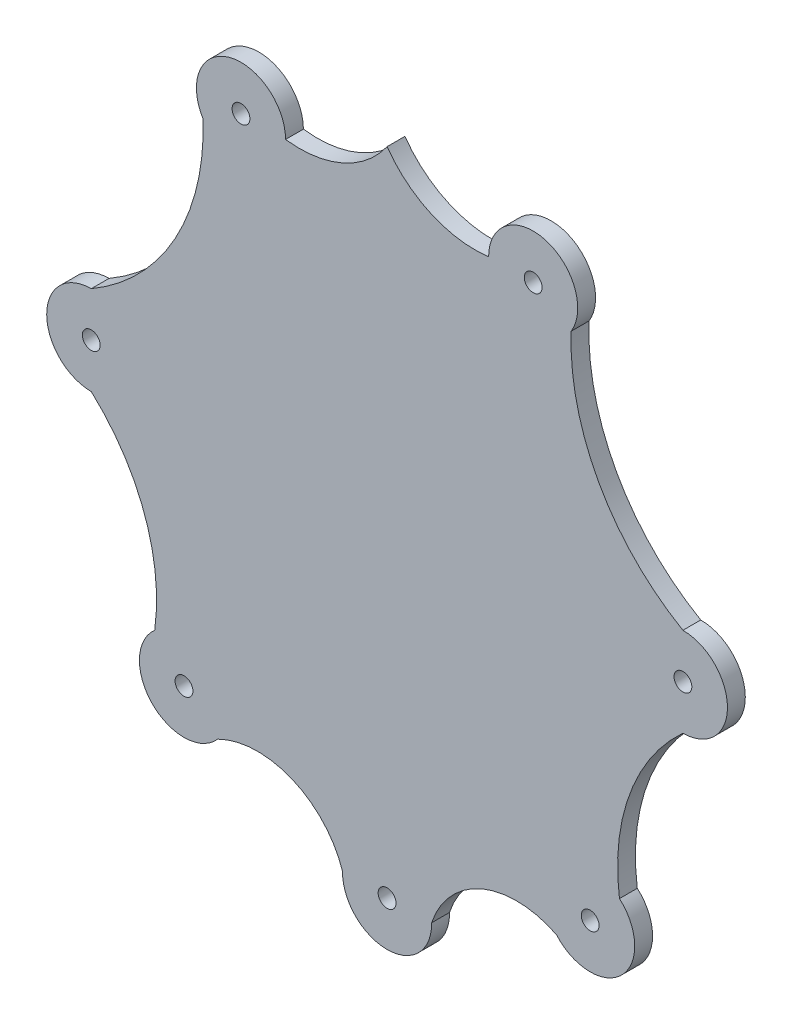
ISO-10303-21;
HEADER;
FILE_DESCRIPTION(('STEP AP214'),'2;1');
FILE_NAME('part.step','',(''),(''),'','','');
FILE_SCHEMA(('AUTOMOTIVE_DESIGN { 1 0 10303 214 1 1 1 1 }'));
ENDSEC;
DATA;
#1=APPLICATION_CONTEXT('core data for automotive mechanical design processes');
#2=APPLICATION_PROTOCOL_DEFINITION('international standard','automotive_design',2000,#1);
#3=PRODUCT_CONTEXT('',#1,'mechanical');
#4=PRODUCT('Part','Part','',(#3));
#5=PRODUCT_RELATED_PRODUCT_CATEGORY('part','',(#4));
#6=PRODUCT_DEFINITION_FORMATION('','',#4);
#7=PRODUCT_DEFINITION_CONTEXT('part definition',#1,'design');
#8=PRODUCT_DEFINITION('design','',#6,#7);
#9=PRODUCT_DEFINITION_SHAPE('','',#8);
#10=(LENGTH_UNIT() NAMED_UNIT(*) SI_UNIT(.MILLI.,.METRE.));
#11=(NAMED_UNIT(*) PLANE_ANGLE_UNIT() SI_UNIT($,.RADIAN.));
#12=(NAMED_UNIT(*) SI_UNIT($,.STERADIAN.) SOLID_ANGLE_UNIT());
#13=UNCERTAINTY_MEASURE_WITH_UNIT(LENGTH_MEASURE(1.E-05),#10,'distance_accuracy_value','');
#14=(GEOMETRIC_REPRESENTATION_CONTEXT(3) GLOBAL_UNCERTAINTY_ASSIGNED_CONTEXT((#13)) GLOBAL_UNIT_ASSIGNED_CONTEXT((#10,
#11,#12)) REPRESENTATION_CONTEXT('',''));
#15=CARTESIAN_POINT('',(0.,0.,0.));
#16=DIRECTION('',(0.,0.,1.));
#17=DIRECTION('',(1.,0.,0.));
#18=AXIS2_PLACEMENT_3D('',#15,#16,#17);
#19=CARTESIAN_POINT('',(-46.0489013592421,105.344998508358,5.));
#20=DIRECTION('',(0.,0.,1.));
#21=DIRECTION('',(1.,0.,0.));
#22=AXIS2_PLACEMENT_3D('',#19,#20,#21);
#23=PLANE('',#22);
#24=CARTESIAN_POINT('',(-102.986841911195,38.9932047085217,5.));
#25=DIRECTION('',(0.,0.,-1.));
#26=DIRECTION('',(-1.,0.,0.));
#27=AXIS2_PLACEMENT_3D('',#24,#25,#26);
#28=CIRCLE('',#27,2.5);
#29=CARTESIAN_POINT('',(-105.486841911195,38.9932047085217,5.));
#30=VERTEX_POINT('',#29);
#31=EDGE_CURVE('E248',#30,#30,#28,.T.);
#32=ORIENTED_EDGE('',*,*,#31,.T.);
#33=EDGE_LOOP('',(#32));
#34=FACE_BOUND('',#33,.T.);
#35=CARTESIAN_POINT('',(-129.,110.,5.));
#36=DIRECTION('',(0.,0.,-1.));
#37=DIRECTION('',(-1.,0.,0.));
#38=AXIS2_PLACEMENT_3D('',#35,#36,#37);
#39=CIRCLE('',#38,2.5);
#40=CARTESIAN_POINT('',(-131.5,110.,5.));
#41=VERTEX_POINT('',#40);
#42=EDGE_CURVE('E251',#41,#41,#39,.T.);
#43=ORIENTED_EDGE('',*,*,#42,.T.);
#44=EDGE_LOOP('',(#43));
#45=FACE_BOUND('',#44,.T.);
#46=CARTESIAN_POINT('',(-87.,186.,5.));
#47=DIRECTION('',(0.,0.,-1.));
#48=DIRECTION('',(-1.,0.,0.));
#49=AXIS2_PLACEMENT_3D('',#46,#47,#48);
#50=CIRCLE('',#49,2.5);
#51=CARTESIAN_POINT('',(-89.5,186.,5.));
#52=VERTEX_POINT('',#51);
#53=EDGE_CURVE('E254',#52,#52,#50,.T.);
#54=ORIENTED_EDGE('',*,*,#53,.T.);
#55=EDGE_LOOP('',(#54));
#56=FACE_BOUND('',#55,.T.);
#57=CARTESIAN_POINT('',(-46.0179505234573,15.949312442422,5.));
#58=DIRECTION('',(0.,0.,-1.));
#59=DIRECTION('',(-1.,0.,0.));
#60=AXIS2_PLACEMENT_3D('',#57,#58,#59);
#61=CIRCLE('',#60,2.5);
#62=CARTESIAN_POINT('',(-48.5179505234573,15.949312442422,5.));
#63=VERTEX_POINT('',#62);
#64=EDGE_CURVE('E257',#63,#63,#61,.T.);
#65=ORIENTED_EDGE('',*,*,#64,.T.);
#66=EDGE_LOOP('',(#65));
#67=FACE_BOUND('',#66,.T.);
#68=CARTESIAN_POINT('',(10.9509408642802,38.9932047085217,5.));
#69=DIRECTION('',(0.,0.,-1.));
#70=DIRECTION('',(-1.,0.,0.));
#71=AXIS2_PLACEMENT_3D('',#68,#69,#70);
#72=CIRCLE('',#71,2.5);
#73=CARTESIAN_POINT('',(8.45094086428022,38.9932047085217,5.));
#74=VERTEX_POINT('',#73);
#75=EDGE_CURVE('E260',#74,#74,#72,.T.);
#76=ORIENTED_EDGE('',*,*,#75,.T.);
#77=EDGE_LOOP('',(#76));
#78=FACE_BOUND('',#77,.T.);
#79=CARTESIAN_POINT('',(-5.03590104691458,186.,5.));
#80=DIRECTION('',(0.,0.,-1.));
#81=DIRECTION('',(-1.,0.,0.));
#82=AXIS2_PLACEMENT_3D('',#79,#80,#81);
#83=CIRCLE('',#82,2.5);
#84=CARTESIAN_POINT('',(-7.53590104691458,186.,5.));
#85=VERTEX_POINT('',#84);
#86=EDGE_CURVE('E262',#85,#85,#83,.T.);
#87=ORIENTED_EDGE('',*,*,#86,.T.);
#88=EDGE_LOOP('',(#87));
#89=FACE_BOUND('',#88,.T.);
#90=CARTESIAN_POINT('',(36.9640989530854,110.,5.));
#91=DIRECTION('',(0.,0.,-1.));
#92=DIRECTION('',(-1.,0.,0.));
#93=AXIS2_PLACEMENT_3D('',#90,#91,#92);
#94=CIRCLE('',#93,2.5);
#95=CARTESIAN_POINT('',(34.4640989530854,110.,5.));
#96=VERTEX_POINT('',#95);
#97=EDGE_CURVE('E133',#96,#96,#94,.T.);
#98=ORIENTED_EDGE('',*,*,#97,.T.);
#99=EDGE_LOOP('',(#98));
#100=FACE_BOUND('',#99,.T.);
#101=CARTESIAN_POINT('',(-70.5892479757029,215.788187083648,5.));
#102=DIRECTION('',(0.,0.,1.));
#103=DIRECTION('',(1.,0.,0.));
#104=AXIS2_PLACEMENT_3D('',#101,#102,#103);
#105=CIRCLE('',#104,30.0438025410554);
#106=CARTESIAN_POINT('',(-46.0179505234573,198.5,5.));
#107=VERTEX_POINT('',#106);
#108=CARTESIAN_POINT('',(-74.5,186.,5.));
#109=VERTEX_POINT('',#108);
#110=EDGE_CURVE('E148',#107,#109,#105,.F.);
#111=ORIENTED_EDGE('',*,*,#110,.T.);
#112=CARTESIAN_POINT('',(-87.,186.,5.));
#113=DIRECTION('',(0.,0.,1.));
#114=DIRECTION('',(1.,0.,0.));
#115=AXIS2_PLACEMENT_3D('',#112,#113,#114);
#116=CIRCLE('',#115,12.5);
#117=CARTESIAN_POINT('',(-97.6699129534475,179.488244663238,5.));
#118=VERTEX_POINT('',#117);
#119=EDGE_CURVE('E145',#118,#109,#116,.F.);
#120=ORIENTED_EDGE('',*,*,#119,.F.);
#121=CARTESIAN_POINT('',(-160.416977120088,176.878123739293,5.));
#122=DIRECTION('',(0.,0.,1.));
#123=DIRECTION('',(1.,0.,0.));
#124=AXIS2_PLACEMENT_3D('',#121,#122,#123);
#125=CIRCLE('',#124,62.8013279538742);
#126=CARTESIAN_POINT('',(-129.,122.499999999999,5.));
#127=VERTEX_POINT('',#126);
#128=EDGE_CURVE('E137',#118,#127,#125,.F.);
#129=ORIENTED_EDGE('',*,*,#128,.T.);
#130=CARTESIAN_POINT('',(-129.,110.,5.));
#131=DIRECTION('',(0.,0.,1.));
#132=DIRECTION('',(1.,0.,0.));
#133=AXIS2_PLACEMENT_3D('',#130,#131,#132);
#134=CIRCLE('',#133,12.4999999999988);
#135=CARTESIAN_POINT('',(-129.,97.5000000000013,5.));
#136=VERTEX_POINT('',#135);
#137=EDGE_CURVE('E130',#136,#127,#134,.F.);
#138=ORIENTED_EDGE('',*,*,#137,.F.);
#139=CARTESIAN_POINT('',(-166.683339145852,56.0655336656249,5.));
#140=DIRECTION('',(0.,0.,1.));
#141=DIRECTION('',(1.,0.,0.));
#142=AXIS2_PLACEMENT_3D('',#139,#140,#141);
#143=CIRCLE('',#142,56.0075802869209);
#144=CARTESIAN_POINT('',(-111.200647436843,48.4156990060434,5.));
#145=VERTEX_POINT('',#144);
#146=EDGE_CURVE('E19',#136,#145,#143,.F.);
#147=ORIENTED_EDGE('',*,*,#146,.T.);
#148=CARTESIAN_POINT('',(-102.986841911195,38.9932047085217,5.));
#149=DIRECTION('',(0.,0.,1.));
#150=DIRECTION('',(1.,0.,0.));
#151=AXIS2_PLACEMENT_3D('',#148,#149,#150);
#152=CIRCLE('',#151,12.5);
#153=CARTESIAN_POINT('',(-93.553180016707,30.7922277386425,5.));
#154=VERTEX_POINT('',#153);
#155=EDGE_CURVE('E128',#154,#145,#152,.F.);
#156=ORIENTED_EDGE('',*,*,#155,.F.);
#157=CARTESIAN_POINT('',(-82.3260805145803,8.38866064549752,5.));
#158=DIRECTION('',(0.,0.,1.));
#159=DIRECTION('',(1.,0.,0.));
#160=AXIS2_PLACEMENT_3D('',#157,#158,#159);
#161=CIRCLE('',#160,25.0592813489873);
#162=CARTESIAN_POINT('',(-58.515431911795,16.2002286598195,5.));
#163=VERTEX_POINT('',#162);
#164=EDGE_CURVE('E178',#154,#163,#161,.F.);
#165=ORIENTED_EDGE('',*,*,#164,.T.);
#166=CARTESIAN_POINT('',(-46.0179505234573,15.949312442422,5.));
#167=DIRECTION('',(0.,0.,1.));
#168=DIRECTION('',(1.,0.,0.));
#169=AXIS2_PLACEMENT_3D('',#166,#167,#168);
#170=CIRCLE('',#169,12.5);
#171=CARTESIAN_POINT('',(-33.5204691351196,16.2002286598196,5.));
#172=VERTEX_POINT('',#171);
#173=EDGE_CURVE('E175',#172,#163,#170,.F.);
#174=ORIENTED_EDGE('',*,*,#173,.F.);
#175=CARTESIAN_POINT('',(-9.70982053233428,8.38866064549752,5.));
#176=DIRECTION('',(0.,0.,1.));
#177=DIRECTION('',(1.,0.,0.));
#178=AXIS2_PLACEMENT_3D('',#175,#176,#177);
#179=CIRCLE('',#178,25.0592813489873);
#180=CARTESIAN_POINT('',(1.51727896979237,30.7922277386425,5.));
#181=VERTEX_POINT('',#180);
#182=EDGE_CURVE('E171',#172,#181,#179,.F.);
#183=ORIENTED_EDGE('',*,*,#182,.T.);
#184=CARTESIAN_POINT('',(10.9509408642802,38.9932047085217,5.));
#185=DIRECTION('',(0.,0.,1.));
#186=DIRECTION('',(1.,0.,0.));
#187=AXIS2_PLACEMENT_3D('',#184,#185,#186);
#188=CIRCLE('',#187,12.5);
#189=CARTESIAN_POINT('',(19.1647463899285,48.4156990060434,5.));
#190=VERTEX_POINT('',#189);
#191=EDGE_CURVE('E168',#190,#181,#188,.F.);
#192=ORIENTED_EDGE('',*,*,#191,.F.);
#193=CARTESIAN_POINT('',(74.6474380989377,56.0655336656249,5.));
#194=DIRECTION('',(0.,0.,1.));
#195=DIRECTION('',(1.,0.,0.));
#196=AXIS2_PLACEMENT_3D('',#193,#194,#195);
#197=CIRCLE('',#196,56.0075802869209);
#198=CARTESIAN_POINT('',(36.9640989530854,97.5000000000013,5.));
#199=VERTEX_POINT('',#198);
#200=EDGE_CURVE('E164',#190,#199,#197,.F.);
#201=ORIENTED_EDGE('',*,*,#200,.T.);
#202=CARTESIAN_POINT('',(36.9640989530854,110.,5.));
#203=DIRECTION('',(0.,0.,1.));
#204=DIRECTION('',(1.,0.,0.));
#205=AXIS2_PLACEMENT_3D('',#202,#203,#204);
#206=CIRCLE('',#205,12.4999999999988);
#207=CARTESIAN_POINT('',(36.9640989530854,122.499999999999,5.));
#208=VERTEX_POINT('',#207);
#209=EDGE_CURVE('E161',#208,#199,#206,.F.);
#210=ORIENTED_EDGE('',*,*,#209,.F.);
#211=CARTESIAN_POINT('',(68.381076073173,176.878123739293,5.));
#212=DIRECTION('',(0.,0.,1.));
#213=DIRECTION('',(1.,0.,0.));
#214=AXIS2_PLACEMENT_3D('',#211,#212,#213);
#215=CIRCLE('',#214,62.8013279538742);
#216=CARTESIAN_POINT('',(5.63401190653296,179.488244663238,5.));
#217=VERTEX_POINT('',#216);
#218=EDGE_CURVE('E157',#208,#217,#215,.F.);
#219=ORIENTED_EDGE('',*,*,#218,.T.);
#220=CARTESIAN_POINT('',(-5.03590104691458,186.,5.));
#221=DIRECTION('',(0.,0.,1.));
#222=DIRECTION('',(1.,0.,0.));
#223=AXIS2_PLACEMENT_3D('',#220,#221,#222);
#224=CIRCLE('',#223,12.5);
#225=CARTESIAN_POINT('',(-17.5359010469146,186.,5.));
#226=VERTEX_POINT('',#225);
#227=EDGE_CURVE('E154',#226,#217,#224,.F.);
#228=ORIENTED_EDGE('',*,*,#227,.F.);
#229=CARTESIAN_POINT('',(-21.4466530712117,215.788187083648,5.));
#230=DIRECTION('',(0.,0.,1.));
#231=DIRECTION('',(1.,0.,0.));
#232=AXIS2_PLACEMENT_3D('',#229,#230,#231);
#233=CIRCLE('',#232,30.0438025410554);
#234=EDGE_CURVE('E151',#226,#107,#233,.F.);
#235=ORIENTED_EDGE('',*,*,#234,.T.);
#236=EDGE_LOOP('',(#111,#120,#129,#138,#147,#156,#165,#174,#183,#192,#201,#210,#219,#228,#235));
#237=FACE_BOUND('',#236,.T.);
#238=ADVANCED_FACE('F16',(#34,#45,#56,#67,#78,#89,#100,#237),#23,.T.);
#239=CARTESIAN_POINT('',(-166.683339145852,56.0655336656249,0.));
#240=DIRECTION('',(0.,0.,1.));
#241=DIRECTION('',(1.,0.,0.));
#242=AXIS2_PLACEMENT_3D('',#239,#240,#241);
#243=CYLINDRICAL_SURFACE('',#242,56.0075802869209);
#244=DIRECTION('',(0.,0.,1.));
#245=VECTOR('',#244,1.);
#246=CARTESIAN_POINT('',(-129.,97.5000000000013,0.));
#247=LINE('',#246,#245);
#248=CARTESIAN_POINT('',(-129.,97.5000000000013,0.));
#249=VERTEX_POINT('',#248);
#250=EDGE_CURVE('E124',#249,#136,#247,.T.);
#251=ORIENTED_EDGE('',*,*,#250,.F.);
#252=CARTESIAN_POINT('',(-166.683339145852,56.0655336656249,0.));
#253=DIRECTION('',(0.,0.,1.));
#254=DIRECTION('',(1.,0.,0.));
#255=AXIS2_PLACEMENT_3D('',#252,#253,#254);
#256=CIRCLE('',#255,56.0075802869209);
#257=CARTESIAN_POINT('',(-111.200647436843,48.4156990060434,0.));
#258=VERTEX_POINT('',#257);
#259=EDGE_CURVE('E246',#249,#258,#256,.F.);
#260=ORIENTED_EDGE('',*,*,#259,.T.);
#261=DIRECTION('',(0.,0.,1.));
#262=VECTOR('',#261,1.);
#263=CARTESIAN_POINT('',(-111.200647436843,48.4156990060434,0.));
#264=LINE('',#263,#262);
#265=EDGE_CURVE('E125',#145,#258,#264,.F.);
#266=ORIENTED_EDGE('',*,*,#265,.F.);
#267=ORIENTED_EDGE('',*,*,#146,.F.);
#268=EDGE_LOOP('',(#251,#260,#266,#267));
#269=FACE_BOUND('',#268,.T.);
#270=ADVANCED_FACE('F122',(#269),#243,.F.);
#271=CARTESIAN_POINT('',(-102.986841911195,38.9932047085217,0.));
#272=DIRECTION('',(0.,0.,1.));
#273=DIRECTION('',(1.,0.,0.));
#274=AXIS2_PLACEMENT_3D('',#271,#272,#273);
#275=CYLINDRICAL_SURFACE('',#274,12.5);
#276=CARTESIAN_POINT('',(-102.986841911195,38.9932047085217,0.));
#277=DIRECTION('',(0.,0.,1.));
#278=DIRECTION('',(1.,0.,0.));
#279=AXIS2_PLACEMENT_3D('',#276,#277,#278);
#280=CIRCLE('',#279,12.5);
#281=CARTESIAN_POINT('',(-93.553180016707,30.7922277386425,0.));
#282=VERTEX_POINT('',#281);
#283=EDGE_CURVE('E244',#258,#282,#280,.T.);
#284=ORIENTED_EDGE('',*,*,#283,.T.);
#285=DIRECTION('',(0.,0.,1.));
#286=VECTOR('',#285,1.);
#287=CARTESIAN_POINT('',(-93.553180016707,30.7922277386425,0.));
#288=LINE('',#287,#286);
#289=EDGE_CURVE('E180',#282,#154,#288,.T.);
#290=ORIENTED_EDGE('',*,*,#289,.T.);
#291=ORIENTED_EDGE('',*,*,#155,.T.);
#292=ORIENTED_EDGE('',*,*,#265,.T.);
#293=EDGE_LOOP('',(#284,#290,#291,#292));
#294=FACE_BOUND('',#293,.T.);
#295=ADVANCED_FACE('F318',(#294),#275,.T.);
#296=CARTESIAN_POINT('',(-82.3260805145803,8.38866064549752,0.));
#297=DIRECTION('',(0.,0.,1.));
#298=DIRECTION('',(1.,0.,0.));
#299=AXIS2_PLACEMENT_3D('',#296,#297,#298);
#300=CYLINDRICAL_SURFACE('',#299,25.0592813489873);
#301=ORIENTED_EDGE('',*,*,#289,.F.);
#302=CARTESIAN_POINT('',(-82.3260805145803,8.38866064549752,0.));
#303=DIRECTION('',(0.,0.,1.));
#304=DIRECTION('',(1.,0.,0.));
#305=AXIS2_PLACEMENT_3D('',#302,#303,#304);
#306=CIRCLE('',#305,25.0592813489873);
#307=CARTESIAN_POINT('',(-58.515431911795,16.2002286598195,0.));
#308=VERTEX_POINT('',#307);
#309=EDGE_CURVE('E241',#282,#308,#306,.F.);
#310=ORIENTED_EDGE('',*,*,#309,.T.);
#311=DIRECTION('',(0.,0.,1.));
#312=VECTOR('',#311,1.);
#313=CARTESIAN_POINT('',(-58.515431911795,16.2002286598196,0.));
#314=LINE('',#313,#312);
#315=EDGE_CURVE('E177',#163,#308,#314,.F.);
#316=ORIENTED_EDGE('',*,*,#315,.F.);
#317=ORIENTED_EDGE('',*,*,#164,.F.);
#318=EDGE_LOOP('',(#301,#310,#316,#317));
#319=FACE_BOUND('',#318,.T.);
#320=ADVANCED_FACE('F317',(#319),#300,.F.);
#321=CARTESIAN_POINT('',(-46.0179505234573,15.949312442422,0.));
#322=DIRECTION('',(0.,0.,1.));
#323=DIRECTION('',(1.,0.,0.));
#324=AXIS2_PLACEMENT_3D('',#321,#322,#323);
#325=CYLINDRICAL_SURFACE('',#324,12.5);
#326=CARTESIAN_POINT('',(-46.0179505234573,15.949312442422,0.));
#327=DIRECTION('',(0.,0.,1.));
#328=DIRECTION('',(1.,0.,0.));
#329=AXIS2_PLACEMENT_3D('',#326,#327,#328);
#330=CIRCLE('',#329,12.5);
#331=CARTESIAN_POINT('',(-33.5204691351196,16.2002286598196,0.));
#332=VERTEX_POINT('',#331);
#333=EDGE_CURVE('E238',#308,#332,#330,.T.);
#334=ORIENTED_EDGE('',*,*,#333,.T.);
#335=DIRECTION('',(0.,0.,1.));
#336=VECTOR('',#335,1.);
#337=CARTESIAN_POINT('',(-33.5204691351196,16.2002286598196,0.));
#338=LINE('',#337,#336);
#339=EDGE_CURVE('E174',#332,#172,#338,.T.);
#340=ORIENTED_EDGE('',*,*,#339,.T.);
#341=ORIENTED_EDGE('',*,*,#173,.T.);
#342=ORIENTED_EDGE('',*,*,#315,.T.);
#343=EDGE_LOOP('',(#334,#340,#341,#342));
#344=FACE_BOUND('',#343,.T.);
#345=ADVANCED_FACE('F311',(#344),#325,.T.);
#346=CARTESIAN_POINT('',(-9.70982053233428,8.38866064549752,0.));
#347=DIRECTION('',(0.,0.,1.));
#348=DIRECTION('',(1.,0.,0.));
#349=AXIS2_PLACEMENT_3D('',#346,#347,#348);
#350=CYLINDRICAL_SURFACE('',#349,25.0592813489873);
#351=ORIENTED_EDGE('',*,*,#339,.F.);
#352=CARTESIAN_POINT('',(-9.70982053233428,8.38866064549752,0.));
#353=DIRECTION('',(0.,0.,1.));
#354=DIRECTION('',(1.,0.,0.));
#355=AXIS2_PLACEMENT_3D('',#352,#353,#354);
#356=CIRCLE('',#355,25.0592813489873);
#357=CARTESIAN_POINT('',(1.51727896979237,30.7922277386425,0.));
#358=VERTEX_POINT('',#357);
#359=EDGE_CURVE('E235',#332,#358,#356,.F.);
#360=ORIENTED_EDGE('',*,*,#359,.T.);
#361=DIRECTION('',(0.,0.,1.));
#362=VECTOR('',#361,1.);
#363=CARTESIAN_POINT('',(1.51727896979237,30.7922277386425,0.));
#364=LINE('',#363,#362);
#365=EDGE_CURVE('E170',#181,#358,#364,.F.);
#366=ORIENTED_EDGE('',*,*,#365,.F.);
#367=ORIENTED_EDGE('',*,*,#182,.F.);
#368=EDGE_LOOP('',(#351,#360,#366,#367));
#369=FACE_BOUND('',#368,.T.);
#370=ADVANCED_FACE('F330',(#369),#350,.F.);
#371=CARTESIAN_POINT('',(10.9509408642802,38.9932047085217,0.));
#372=DIRECTION('',(0.,0.,1.));
#373=DIRECTION('',(1.,0.,0.));
#374=AXIS2_PLACEMENT_3D('',#371,#372,#373);
#375=CYLINDRICAL_SURFACE('',#374,12.5);
#376=CARTESIAN_POINT('',(10.9509408642802,38.9932047085217,0.));
#377=DIRECTION('',(0.,0.,1.));
#378=DIRECTION('',(1.,0.,0.));
#379=AXIS2_PLACEMENT_3D('',#376,#377,#378);
#380=CIRCLE('',#379,12.5);
#381=CARTESIAN_POINT('',(19.1647463899285,48.4156990060434,0.));
#382=VERTEX_POINT('',#381);
#383=EDGE_CURVE('E232',#358,#382,#380,.T.);
#384=ORIENTED_EDGE('',*,*,#383,.T.);
#385=DIRECTION('',(0.,0.,1.));
#386=VECTOR('',#385,1.);
#387=CARTESIAN_POINT('',(19.1647463899285,48.4156990060434,0.));
#388=LINE('',#387,#386);
#389=EDGE_CURVE('E167',#382,#190,#388,.T.);
#390=ORIENTED_EDGE('',*,*,#389,.T.);
#391=ORIENTED_EDGE('',*,*,#191,.T.);
#392=ORIENTED_EDGE('',*,*,#365,.T.);
#393=EDGE_LOOP('',(#384,#390,#391,#392));
#394=FACE_BOUND('',#393,.T.);
#395=ADVANCED_FACE('F333',(#394),#375,.T.);
#396=CARTESIAN_POINT('',(74.6474380989377,56.0655336656249,0.));
#397=DIRECTION('',(0.,0.,1.));
#398=DIRECTION('',(1.,0.,0.));
#399=AXIS2_PLACEMENT_3D('',#396,#397,#398);
#400=CYLINDRICAL_SURFACE('',#399,56.0075802869209);
#401=ORIENTED_EDGE('',*,*,#389,.F.);
#402=CARTESIAN_POINT('',(74.6474380989377,56.0655336656249,0.));
#403=DIRECTION('',(0.,0.,1.));
#404=DIRECTION('',(1.,0.,0.));
#405=AXIS2_PLACEMENT_3D('',#402,#403,#404);
#406=CIRCLE('',#405,56.0075802869209);
#407=CARTESIAN_POINT('',(36.9640989530854,97.5000000000013,0.));
#408=VERTEX_POINT('',#407);
#409=EDGE_CURVE('E229',#382,#408,#406,.F.);
#410=ORIENTED_EDGE('',*,*,#409,.T.);
#411=DIRECTION('',(0.,0.,1.));
#412=VECTOR('',#411,1.);
#413=CARTESIAN_POINT('',(36.9640989530854,97.5000000000013,0.));
#414=LINE('',#413,#412);
#415=EDGE_CURVE('E163',#199,#408,#414,.F.);
#416=ORIENTED_EDGE('',*,*,#415,.F.);
#417=ORIENTED_EDGE('',*,*,#200,.F.);
#418=EDGE_LOOP('',(#401,#410,#416,#417));
#419=FACE_BOUND('',#418,.T.);
#420=ADVANCED_FACE('F337',(#419),#400,.F.);
#421=CARTESIAN_POINT('',(36.9640989530854,110.,0.));
#422=DIRECTION('',(0.,0.,1.));
#423=DIRECTION('',(1.,0.,0.));
#424=AXIS2_PLACEMENT_3D('',#421,#422,#423);
#425=CYLINDRICAL_SURFACE('',#424,12.4999999999988);
#426=CARTESIAN_POINT('',(36.9640989530854,110.,0.));
#427=DIRECTION('',(0.,0.,1.));
#428=DIRECTION('',(1.,0.,0.));
#429=AXIS2_PLACEMENT_3D('',#426,#427,#428);
#430=CIRCLE('',#429,12.4999999999988);
#431=CARTESIAN_POINT('',(36.9640989530855,122.499999999999,0.));
#432=VERTEX_POINT('',#431);
#433=EDGE_CURVE('E226',#408,#432,#430,.T.);
#434=ORIENTED_EDGE('',*,*,#433,.T.);
#435=DIRECTION('',(0.,0.,1.));
#436=VECTOR('',#435,1.);
#437=CARTESIAN_POINT('',(36.9640989530854,122.499999999999,0.));
#438=LINE('',#437,#436);
#439=EDGE_CURVE('E160',#432,#208,#438,.T.);
#440=ORIENTED_EDGE('',*,*,#439,.T.);
#441=ORIENTED_EDGE('',*,*,#209,.T.);
#442=ORIENTED_EDGE('',*,*,#415,.T.);
#443=EDGE_LOOP('',(#434,#440,#441,#442));
#444=FACE_BOUND('',#443,.T.);
#445=ADVANCED_FACE('F341',(#444),#425,.T.);
#446=CARTESIAN_POINT('',(68.381076073173,176.878123739293,0.));
#447=DIRECTION('',(0.,0.,1.));
#448=DIRECTION('',(1.,0.,0.));
#449=AXIS2_PLACEMENT_3D('',#446,#447,#448);
#450=CYLINDRICAL_SURFACE('',#449,62.8013279538742);
#451=ORIENTED_EDGE('',*,*,#439,.F.);
#452=CARTESIAN_POINT('',(68.381076073173,176.878123739293,0.));
#453=DIRECTION('',(0.,0.,1.));
#454=DIRECTION('',(1.,0.,0.));
#455=AXIS2_PLACEMENT_3D('',#452,#453,#454);
#456=CIRCLE('',#455,62.8013279538742);
#457=CARTESIAN_POINT('',(5.63401190653296,179.488244663238,0.));
#458=VERTEX_POINT('',#457);
#459=EDGE_CURVE('E223',#432,#458,#456,.F.);
#460=ORIENTED_EDGE('',*,*,#459,.T.);
#461=DIRECTION('',(0.,0.,1.));
#462=VECTOR('',#461,1.);
#463=CARTESIAN_POINT('',(5.63401190653297,179.488244663238,0.));
#464=LINE('',#463,#462);
#465=EDGE_CURVE('E156',#217,#458,#464,.F.);
#466=ORIENTED_EDGE('',*,*,#465,.F.);
#467=ORIENTED_EDGE('',*,*,#218,.F.);
#468=EDGE_LOOP('',(#451,#460,#466,#467));
#469=FACE_BOUND('',#468,.T.);
#470=ADVANCED_FACE('F345',(#469),#450,.F.);
#471=CARTESIAN_POINT('',(-5.03590104691458,186.,0.));
#472=DIRECTION('',(0.,0.,1.));
#473=DIRECTION('',(1.,0.,0.));
#474=AXIS2_PLACEMENT_3D('',#471,#472,#473);
#475=CYLINDRICAL_SURFACE('',#474,12.5);
#476=CARTESIAN_POINT('',(-5.03590104691458,186.,0.));
#477=DIRECTION('',(0.,0.,1.));
#478=DIRECTION('',(1.,0.,0.));
#479=AXIS2_PLACEMENT_3D('',#476,#477,#478);
#480=CIRCLE('',#479,12.5);
#481=CARTESIAN_POINT('',(-17.5359010469146,186.,0.));
#482=VERTEX_POINT('',#481);
#483=EDGE_CURVE('E220',#458,#482,#480,.T.);
#484=ORIENTED_EDGE('',*,*,#483,.T.);
#485=DIRECTION('',(0.,0.,1.));
#486=VECTOR('',#485,1.);
#487=CARTESIAN_POINT('',(-17.5359010469146,186.,0.));
#488=LINE('',#487,#486);
#489=EDGE_CURVE('E153',#482,#226,#488,.T.);
#490=ORIENTED_EDGE('',*,*,#489,.T.);
#491=ORIENTED_EDGE('',*,*,#227,.T.);
#492=ORIENTED_EDGE('',*,*,#465,.T.);
#493=EDGE_LOOP('',(#484,#490,#491,#492));
#494=FACE_BOUND('',#493,.T.);
#495=ADVANCED_FACE('F349',(#494),#475,.T.);
#496=CARTESIAN_POINT('',(-21.4466530712117,215.788187083648,0.));
#497=DIRECTION('',(0.,0.,1.));
#498=DIRECTION('',(1.,0.,0.));
#499=AXIS2_PLACEMENT_3D('',#496,#497,#498);
#500=CYLINDRICAL_SURFACE('',#499,30.0438025410554);
#501=ORIENTED_EDGE('',*,*,#489,.F.);
#502=CARTESIAN_POINT('',(-21.4466530712117,215.788187083648,0.));
#503=DIRECTION('',(0.,0.,1.));
#504=DIRECTION('',(1.,0.,0.));
#505=AXIS2_PLACEMENT_3D('',#502,#503,#504);
#506=CIRCLE('',#505,30.0438025410554);
#507=CARTESIAN_POINT('',(-46.0179505234573,198.5,0.));
#508=VERTEX_POINT('',#507);
#509=EDGE_CURVE('E217',#482,#508,#506,.F.);
#510=ORIENTED_EDGE('',*,*,#509,.T.);
#511=DIRECTION('',(0.,0.,1.));
#512=VECTOR('',#511,1.);
#513=CARTESIAN_POINT('',(-46.0179505234573,198.5,0.));
#514=LINE('',#513,#512);
#515=EDGE_CURVE('E150',#508,#107,#514,.T.);
#516=ORIENTED_EDGE('',*,*,#515,.T.);
#517=ORIENTED_EDGE('',*,*,#234,.F.);
#518=EDGE_LOOP('',(#501,#510,#516,#517));
#519=FACE_BOUND('',#518,.T.);
#520=ADVANCED_FACE('F353',(#519),#500,.F.);
#521=CARTESIAN_POINT('',(-70.5892479757029,215.788187083648,0.));
#522=DIRECTION('',(0.,0.,1.));
#523=DIRECTION('',(1.,0.,0.));
#524=AXIS2_PLACEMENT_3D('',#521,#522,#523);
#525=CYLINDRICAL_SURFACE('',#524,30.0438025410554);
#526=ORIENTED_EDGE('',*,*,#515,.F.);
#527=CARTESIAN_POINT('',(-70.5892479757029,215.788187083648,0.));
#528=DIRECTION('',(0.,0.,1.));
#529=DIRECTION('',(1.,0.,0.));
#530=AXIS2_PLACEMENT_3D('',#527,#528,#529);
#531=CIRCLE('',#530,30.0438025410554);
#532=CARTESIAN_POINT('',(-74.5,186.,0.));
#533=VERTEX_POINT('',#532);
#534=EDGE_CURVE('E214',#508,#533,#531,.F.);
#535=ORIENTED_EDGE('',*,*,#534,.T.);
#536=DIRECTION('',(0.,0.,1.));
#537=VECTOR('',#536,1.);
#538=CARTESIAN_POINT('',(-74.5,186.,0.));
#539=LINE('',#538,#537);
#540=EDGE_CURVE('E147',#109,#533,#539,.F.);
#541=ORIENTED_EDGE('',*,*,#540,.F.);
#542=ORIENTED_EDGE('',*,*,#110,.F.);
#543=EDGE_LOOP('',(#526,#535,#541,#542));
#544=FACE_BOUND('',#543,.T.);
#545=ADVANCED_FACE('F357',(#544),#525,.F.);
#546=CARTESIAN_POINT('',(-87.,186.,0.));
#547=DIRECTION('',(0.,0.,1.));
#548=DIRECTION('',(1.,0.,0.));
#549=AXIS2_PLACEMENT_3D('',#546,#547,#548);
#550=CYLINDRICAL_SURFACE('',#549,12.5);
#551=CARTESIAN_POINT('',(-87.,186.,0.));
#552=DIRECTION('',(0.,0.,1.));
#553=DIRECTION('',(1.,0.,0.));
#554=AXIS2_PLACEMENT_3D('',#551,#552,#553);
#555=CIRCLE('',#554,12.5);
#556=CARTESIAN_POINT('',(-97.6699129534475,179.488244663238,0.));
#557=VERTEX_POINT('',#556);
#558=EDGE_CURVE('E211',#533,#557,#555,.T.);
#559=ORIENTED_EDGE('',*,*,#558,.T.);
#560=DIRECTION('',(0.,0.,1.));
#561=VECTOR('',#560,1.);
#562=CARTESIAN_POINT('',(-97.6699129534475,179.488244663238,0.));
#563=LINE('',#562,#561);
#564=EDGE_CURVE('E140',#557,#118,#563,.T.);
#565=ORIENTED_EDGE('',*,*,#564,.T.);
#566=ORIENTED_EDGE('',*,*,#119,.T.);
#567=ORIENTED_EDGE('',*,*,#540,.T.);
#568=EDGE_LOOP('',(#559,#565,#566,#567));
#569=FACE_BOUND('',#568,.T.);
#570=ADVANCED_FACE('F289',(#569),#550,.T.);
#571=CARTESIAN_POINT('',(-160.416977120088,176.878123739293,0.));
#572=DIRECTION('',(0.,0.,1.));
#573=DIRECTION('',(1.,0.,0.));
#574=AXIS2_PLACEMENT_3D('',#571,#572,#573);
#575=CYLINDRICAL_SURFACE('',#574,62.8013279538742);
#576=ORIENTED_EDGE('',*,*,#564,.F.);
#577=CARTESIAN_POINT('',(-160.416977120088,176.878123739293,0.));
#578=DIRECTION('',(0.,0.,1.));
#579=DIRECTION('',(1.,0.,0.));
#580=AXIS2_PLACEMENT_3D('',#577,#578,#579);
#581=CIRCLE('',#580,62.8013279538742);
#582=CARTESIAN_POINT('',(-129.,122.499999999999,0.));
#583=VERTEX_POINT('',#582);
#584=EDGE_CURVE('E208',#557,#583,#581,.F.);
#585=ORIENTED_EDGE('',*,*,#584,.T.);
#586=DIRECTION('',(0.,0.,1.));
#587=VECTOR('',#586,1.);
#588=CARTESIAN_POINT('',(-129.,122.499999999999,0.));
#589=LINE('',#588,#587);
#590=EDGE_CURVE('E34',#127,#583,#589,.F.);
#591=ORIENTED_EDGE('',*,*,#590,.F.);
#592=ORIENTED_EDGE('',*,*,#128,.F.);
#593=EDGE_LOOP('',(#576,#585,#591,#592));
#594=FACE_BOUND('',#593,.T.);
#595=ADVANCED_FACE('F363',(#594),#575,.F.);
#596=CARTESIAN_POINT('',(-129.,110.,0.));
#597=DIRECTION('',(0.,0.,1.));
#598=DIRECTION('',(1.,0.,0.));
#599=AXIS2_PLACEMENT_3D('',#596,#597,#598);
#600=CYLINDRICAL_SURFACE('',#599,12.4999999999988);
#601=CARTESIAN_POINT('',(-129.,110.,0.));
#602=DIRECTION('',(0.,0.,1.));
#603=DIRECTION('',(1.,0.,0.));
#604=AXIS2_PLACEMENT_3D('',#601,#602,#603);
#605=CIRCLE('',#604,12.4999999999988);
#606=EDGE_CURVE('E132',#583,#249,#605,.T.);
#607=ORIENTED_EDGE('',*,*,#606,.T.);
#608=ORIENTED_EDGE('',*,*,#250,.T.);
#609=ORIENTED_EDGE('',*,*,#137,.T.);
#610=ORIENTED_EDGE('',*,*,#590,.T.);
#611=EDGE_LOOP('',(#607,#608,#609,#610));
#612=FACE_BOUND('',#611,.T.);
#613=ADVANCED_FACE('F129',(#612),#600,.T.);
#614=CARTESIAN_POINT('',(36.9640989530854,110.,5.));
#615=DIRECTION('',(0.,0.,-1.));
#616=DIRECTION('',(-1.,0.,0.));
#617=AXIS2_PLACEMENT_3D('',#614,#615,#616);
#618=CYLINDRICAL_SURFACE('',#617,2.5);
#619=ORIENTED_EDGE('',*,*,#97,.F.);
#620=EDGE_LOOP('',(#619));
#621=FACE_BOUND('',#620,.T.);
#622=CARTESIAN_POINT('',(36.9640989530854,110.,0.));
#623=DIRECTION('',(0.,0.,-1.));
#624=DIRECTION('',(-1.,0.,0.));
#625=AXIS2_PLACEMENT_3D('',#622,#623,#624);
#626=CIRCLE('',#625,2.5);
#627=CARTESIAN_POINT('',(34.4640989530854,110.,0.));
#628=VERTEX_POINT('',#627);
#629=EDGE_CURVE('E204',#628,#628,#626,.T.);
#630=ORIENTED_EDGE('',*,*,#629,.T.);
#631=EDGE_LOOP('',(#630));
#632=FACE_BOUND('',#631,.T.);
#633=ADVANCED_FACE('F270',(#621,#632),#618,.F.);
#634=CARTESIAN_POINT('',(-5.03590104691458,186.,5.));
#635=DIRECTION('',(0.,0.,-1.));
#636=DIRECTION('',(-1.,0.,0.));
#637=AXIS2_PLACEMENT_3D('',#634,#635,#636);
#638=CYLINDRICAL_SURFACE('',#637,2.5);
#639=ORIENTED_EDGE('',*,*,#86,.F.);
#640=EDGE_LOOP('',(#639));
#641=FACE_BOUND('',#640,.T.);
#642=CARTESIAN_POINT('',(-5.03590104691458,186.,0.));
#643=DIRECTION('',(0.,0.,-1.));
#644=DIRECTION('',(-1.,0.,0.));
#645=AXIS2_PLACEMENT_3D('',#642,#643,#644);
#646=CIRCLE('',#645,2.5);
#647=CARTESIAN_POINT('',(-7.53590104691458,186.,0.));
#648=VERTEX_POINT('',#647);
#649=EDGE_CURVE('E201',#648,#648,#646,.T.);
#650=ORIENTED_EDGE('',*,*,#649,.T.);
#651=EDGE_LOOP('',(#650));
#652=FACE_BOUND('',#651,.T.);
#653=ADVANCED_FACE('F273',(#641,#652),#638,.F.);
#654=CARTESIAN_POINT('',(10.9509408642802,38.9932047085217,5.));
#655=DIRECTION('',(0.,0.,-1.));
#656=DIRECTION('',(-1.,0.,0.));
#657=AXIS2_PLACEMENT_3D('',#654,#655,#656);
#658=CYLINDRICAL_SURFACE('',#657,2.5);
#659=ORIENTED_EDGE('',*,*,#75,.F.);
#660=EDGE_LOOP('',(#659));
#661=FACE_BOUND('',#660,.T.);
#662=CARTESIAN_POINT('',(10.9509408642802,38.9932047085217,0.));
#663=DIRECTION('',(0.,0.,-1.));
#664=DIRECTION('',(-1.,0.,0.));
#665=AXIS2_PLACEMENT_3D('',#662,#663,#664);
#666=CIRCLE('',#665,2.5);
#667=CARTESIAN_POINT('',(8.45094086428022,38.9932047085217,0.));
#668=VERTEX_POINT('',#667);
#669=EDGE_CURVE('E198',#668,#668,#666,.T.);
#670=ORIENTED_EDGE('',*,*,#669,.T.);
#671=EDGE_LOOP('',(#670));
#672=FACE_BOUND('',#671,.T.);
#673=ADVANCED_FACE('F370',(#661,#672),#658,.F.);
#674=CARTESIAN_POINT('',(-46.0179505234573,15.949312442422,5.));
#675=DIRECTION('',(0.,0.,-1.));
#676=DIRECTION('',(-1.,0.,0.));
#677=AXIS2_PLACEMENT_3D('',#674,#675,#676);
#678=CYLINDRICAL_SURFACE('',#677,2.5);
#679=ORIENTED_EDGE('',*,*,#64,.F.);
#680=EDGE_LOOP('',(#679));
#681=FACE_BOUND('',#680,.T.);
#682=CARTESIAN_POINT('',(-46.0179505234573,15.949312442422,0.));
#683=DIRECTION('',(0.,0.,-1.));
#684=DIRECTION('',(-1.,0.,0.));
#685=AXIS2_PLACEMENT_3D('',#682,#683,#684);
#686=CIRCLE('',#685,2.5);
#687=CARTESIAN_POINT('',(-48.5179505234573,15.949312442422,0.));
#688=VERTEX_POINT('',#687);
#689=EDGE_CURVE('E195',#688,#688,#686,.T.);
#690=ORIENTED_EDGE('',*,*,#689,.T.);
#691=EDGE_LOOP('',(#690));
#692=FACE_BOUND('',#691,.T.);
#693=ADVANCED_FACE('F374',(#681,#692),#678,.F.);
#694=CARTESIAN_POINT('',(-87.,186.,5.));
#695=DIRECTION('',(0.,0.,-1.));
#696=DIRECTION('',(-1.,0.,0.));
#697=AXIS2_PLACEMENT_3D('',#694,#695,#696);
#698=CYLINDRICAL_SURFACE('',#697,2.5);
#699=ORIENTED_EDGE('',*,*,#53,.F.);
#700=EDGE_LOOP('',(#699));
#701=FACE_BOUND('',#700,.T.);
#702=CARTESIAN_POINT('',(-87.,186.,0.));
#703=DIRECTION('',(0.,0.,-1.));
#704=DIRECTION('',(-1.,0.,0.));
#705=AXIS2_PLACEMENT_3D('',#702,#703,#704);
#706=CIRCLE('',#705,2.5);
#707=CARTESIAN_POINT('',(-89.5,186.,0.));
#708=VERTEX_POINT('',#707);
#709=EDGE_CURVE('E192',#708,#708,#706,.T.);
#710=ORIENTED_EDGE('',*,*,#709,.T.);
#711=EDGE_LOOP('',(#710));
#712=FACE_BOUND('',#711,.T.);
#713=ADVANCED_FACE('F378',(#701,#712),#698,.F.);
#714=CARTESIAN_POINT('',(-129.,110.,5.));
#715=DIRECTION('',(0.,0.,-1.));
#716=DIRECTION('',(-1.,0.,0.));
#717=AXIS2_PLACEMENT_3D('',#714,#715,#716);
#718=CYLINDRICAL_SURFACE('',#717,2.5);
#719=ORIENTED_EDGE('',*,*,#42,.F.);
#720=EDGE_LOOP('',(#719));
#721=FACE_BOUND('',#720,.T.);
#722=CARTESIAN_POINT('',(-129.,110.,0.));
#723=DIRECTION('',(0.,0.,-1.));
#724=DIRECTION('',(-1.,0.,0.));
#725=AXIS2_PLACEMENT_3D('',#722,#723,#724);
#726=CIRCLE('',#725,2.5);
#727=CARTESIAN_POINT('',(-131.5,110.,0.));
#728=VERTEX_POINT('',#727);
#729=EDGE_CURVE('E25',#728,#728,#726,.T.);
#730=ORIENTED_EDGE('',*,*,#729,.T.);
#731=EDGE_LOOP('',(#730));
#732=FACE_BOUND('',#731,.T.);
#733=ADVANCED_FACE('F382',(#721,#732),#718,.F.);
#734=CARTESIAN_POINT('',(-102.986841911195,38.9932047085217,5.));
#735=DIRECTION('',(0.,0.,-1.));
#736=DIRECTION('',(-1.,0.,0.));
#737=AXIS2_PLACEMENT_3D('',#734,#735,#736);
#738=CYLINDRICAL_SURFACE('',#737,2.5);
#739=ORIENTED_EDGE('',*,*,#31,.F.);
#740=EDGE_LOOP('',(#739));
#741=FACE_BOUND('',#740,.T.);
#742=CARTESIAN_POINT('',(-102.986841911195,38.9932047085217,0.));
#743=DIRECTION('',(0.,0.,-1.));
#744=DIRECTION('',(-1.,0.,0.));
#745=AXIS2_PLACEMENT_3D('',#742,#743,#744);
#746=CIRCLE('',#745,2.5);
#747=CARTESIAN_POINT('',(-105.486841911195,38.9932047085217,0.));
#748=VERTEX_POINT('',#747);
#749=EDGE_CURVE('E11',#748,#748,#746,.T.);
#750=ORIENTED_EDGE('',*,*,#749,.T.);
#751=EDGE_LOOP('',(#750));
#752=FACE_BOUND('',#751,.T.);
#753=ADVANCED_FACE('F280',(#741,#752),#738,.F.);
#754=CARTESIAN_POINT('',(-46.0489013592421,105.344998508358,0.));
#755=DIRECTION('',(0.,0.,1.));
#756=DIRECTION('',(1.,0.,0.));
#757=AXIS2_PLACEMENT_3D('',#754,#755,#756);
#758=PLANE('',#757);
#759=ORIENTED_EDGE('',*,*,#749,.F.);
#760=EDGE_LOOP('',(#759));
#761=FACE_BOUND('',#760,.T.);
#762=ORIENTED_EDGE('',*,*,#729,.F.);
#763=EDGE_LOOP('',(#762));
#764=FACE_BOUND('',#763,.T.);
#765=ORIENTED_EDGE('',*,*,#709,.F.);
#766=EDGE_LOOP('',(#765));
#767=FACE_BOUND('',#766,.T.);
#768=ORIENTED_EDGE('',*,*,#689,.F.);
#769=EDGE_LOOP('',(#768));
#770=FACE_BOUND('',#769,.T.);
#771=ORIENTED_EDGE('',*,*,#669,.F.);
#772=EDGE_LOOP('',(#771));
#773=FACE_BOUND('',#772,.T.);
#774=ORIENTED_EDGE('',*,*,#649,.F.);
#775=EDGE_LOOP('',(#774));
#776=FACE_BOUND('',#775,.T.);
#777=ORIENTED_EDGE('',*,*,#629,.F.);
#778=EDGE_LOOP('',(#777));
#779=FACE_BOUND('',#778,.T.);
#780=ORIENTED_EDGE('',*,*,#584,.F.);
#781=ORIENTED_EDGE('',*,*,#558,.F.);
#782=ORIENTED_EDGE('',*,*,#534,.F.);
#783=ORIENTED_EDGE('',*,*,#509,.F.);
#784=ORIENTED_EDGE('',*,*,#483,.F.);
#785=ORIENTED_EDGE('',*,*,#459,.F.);
#786=ORIENTED_EDGE('',*,*,#433,.F.);
#787=ORIENTED_EDGE('',*,*,#409,.F.);
#788=ORIENTED_EDGE('',*,*,#383,.F.);
#789=ORIENTED_EDGE('',*,*,#359,.F.);
#790=ORIENTED_EDGE('',*,*,#333,.F.);
#791=ORIENTED_EDGE('',*,*,#309,.F.);
#792=ORIENTED_EDGE('',*,*,#283,.F.);
#793=ORIENTED_EDGE('',*,*,#259,.F.);
#794=ORIENTED_EDGE('',*,*,#606,.F.);
#795=EDGE_LOOP('',(#780,#781,#782,#783,#784,#785,#786,#787,#788,#789,#790,#791,#792,#793,#794));
#796=FACE_BOUND('',#795,.T.);
#797=ADVANCED_FACE('F277',(#761,#764,#767,#770,#773,#776,#779,#796),#758,.F.);
#798=CLOSED_SHELL('',(#238,#270,#295,#320,#345,#370,#395,#420,#445,#470,#495,#520,#545,#570,
#595,#613,#633,#653,#673,#693,#713,#733,#753,#797));
#799=MANIFOLD_SOLID_BREP('B1',#798);
#800=ADVANCED_BREP_SHAPE_REPRESENTATION('',(#18,#799),#14);
#801=SHAPE_DEFINITION_REPRESENTATION(#9,#800);
ENDSEC;
END-ISO-10303-21;
